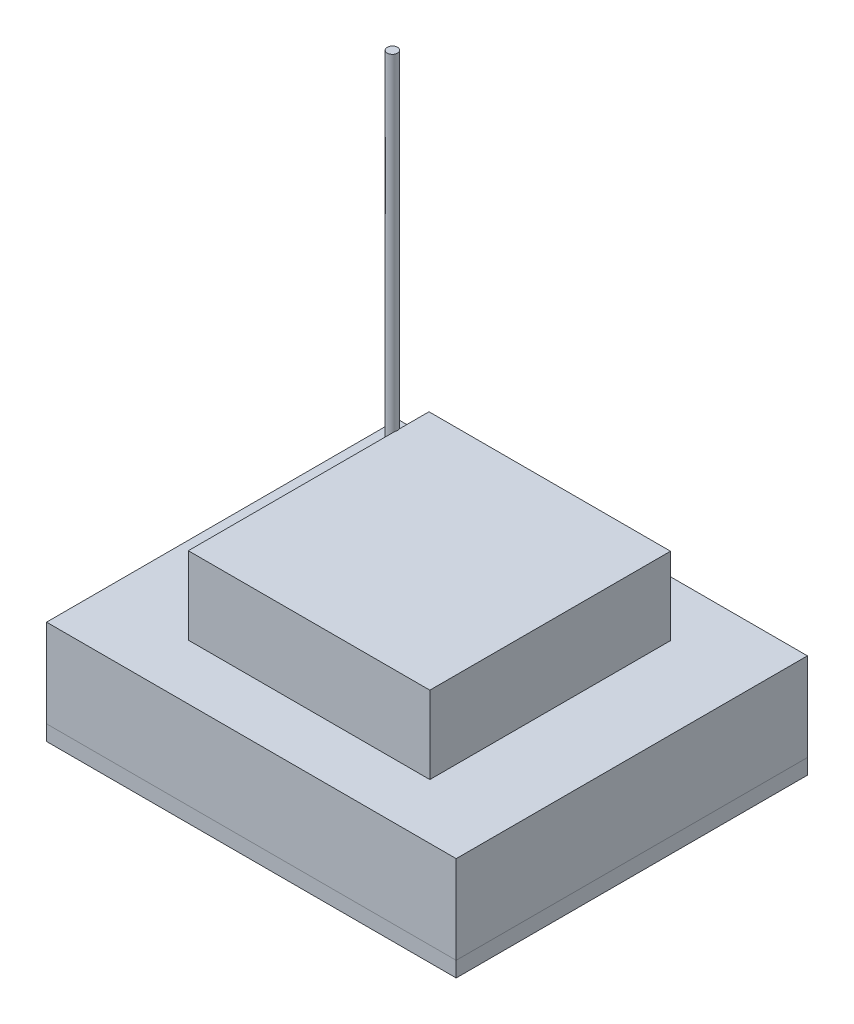
ISO-10303-21;
HEADER;
FILE_DESCRIPTION(('STEP AP214'),'2;1');
FILE_NAME('part.step','',(''),(''),'','','');
FILE_SCHEMA(('AUTOMOTIVE_DESIGN { 1 0 10303 214 1 1 1 1 }'));
ENDSEC;
DATA;
#1=APPLICATION_CONTEXT('core data for automotive mechanical design processes');
#2=APPLICATION_PROTOCOL_DEFINITION('international standard','automotive_design',2000,#1);
#3=PRODUCT_CONTEXT('',#1,'mechanical');
#4=PRODUCT('Part','Part','',(#3));
#5=PRODUCT_RELATED_PRODUCT_CATEGORY('part','',(#4));
#6=PRODUCT_DEFINITION_FORMATION('','',#4);
#7=PRODUCT_DEFINITION_CONTEXT('part definition',#1,'design');
#8=PRODUCT_DEFINITION('design','',#6,#7);
#9=PRODUCT_DEFINITION_SHAPE('','',#8);
#10=(LENGTH_UNIT() NAMED_UNIT(*) SI_UNIT(.MILLI.,.METRE.));
#11=(NAMED_UNIT(*) PLANE_ANGLE_UNIT() SI_UNIT($,.RADIAN.));
#12=(NAMED_UNIT(*) SI_UNIT($,.STERADIAN.) SOLID_ANGLE_UNIT());
#13=UNCERTAINTY_MEASURE_WITH_UNIT(LENGTH_MEASURE(1.E-05),#10,'distance_accuracy_value','');
#14=(GEOMETRIC_REPRESENTATION_CONTEXT(3) GLOBAL_UNCERTAINTY_ASSIGNED_CONTEXT((#13)) GLOBAL_UNIT_ASSIGNED_CONTEXT((#10,
#11,#12)) REPRESENTATION_CONTEXT('',''));
#15=CARTESIAN_POINT('',(0.,0.,0.));
#16=DIRECTION('',(0.,0.,1.));
#17=DIRECTION('',(1.,0.,0.));
#18=AXIS2_PLACEMENT_3D('',#15,#16,#17);
#19=CARTESIAN_POINT('',(-509.3,-147.5835,436.75));
#20=DIRECTION('',(1.,0.,0.));
#21=DIRECTION('',(0.,0.,-1.));
#22=AXIS2_PLACEMENT_3D('',#19,#20,#21);
#23=PLANE('',#22);
#24=DIRECTION('',(0.,0.,-1.));
#25=VECTOR('',#24,1.);
#26=CARTESIAN_POINT('',(-509.3,-109.4835,436.75));
#27=LINE('',#26,#25);
#28=CARTESIAN_POINT('',(-509.3,-109.4835,436.75));
#29=VERTEX_POINT('',#28);
#30=CARTESIAN_POINT('',(-509.3,-109.4835,-436.75));
#31=VERTEX_POINT('',#30);
#32=EDGE_CURVE('E116',#29,#31,#27,.T.);
#33=ORIENTED_EDGE('',*,*,#32,.T.);
#34=DIRECTION('',(0.,1.,0.));
#35=VECTOR('',#34,1.);
#36=CARTESIAN_POINT('',(-509.3,-147.5835,-436.75));
#37=LINE('',#36,#35);
#38=CARTESIAN_POINT('',(-509.3,-147.5835,-436.75));
#39=VERTEX_POINT('',#38);
#40=EDGE_CURVE('E12',#39,#31,#37,.T.);
#41=ORIENTED_EDGE('',*,*,#40,.F.);
#42=DIRECTION('',(0.,0.,-1.));
#43=VECTOR('',#42,1.);
#44=CARTESIAN_POINT('',(-509.3,-147.5835,436.75));
#45=LINE('',#44,#43);
#46=CARTESIAN_POINT('',(-509.3,-147.5835,436.75));
#47=VERTEX_POINT('',#46);
#48=EDGE_CURVE('E104',#47,#39,#45,.T.);
#49=ORIENTED_EDGE('',*,*,#48,.F.);
#50=DIRECTION('',(0.,1.,0.));
#51=VECTOR('',#50,1.);
#52=CARTESIAN_POINT('',(-509.3,-147.5835,436.75));
#53=LINE('',#52,#51);
#54=EDGE_CURVE('E112',#47,#29,#53,.T.);
#55=ORIENTED_EDGE('',*,*,#54,.T.);
#56=EDGE_LOOP('',(#33,#41,#49,#55));
#57=FACE_BOUND('',#56,.T.);
#58=ADVANCED_FACE('F53',(#57),#23,.F.);
#59=CARTESIAN_POINT('',(-509.3,-147.5835,-436.75));
#60=DIRECTION('',(0.,0.,1.));
#61=DIRECTION('',(1.,0.,0.));
#62=AXIS2_PLACEMENT_3D('',#59,#60,#61);
#63=PLANE('',#62);
#64=DIRECTION('',(1.,0.,0.));
#65=VECTOR('',#64,1.);
#66=CARTESIAN_POINT('',(-509.3,-109.4835,-436.75));
#67=LINE('',#66,#65);
#68=CARTESIAN_POINT('',(509.3,-109.4835,-436.75));
#69=VERTEX_POINT('',#68);
#70=EDGE_CURVE('E108',#31,#69,#67,.T.);
#71=ORIENTED_EDGE('',*,*,#70,.T.);
#72=DIRECTION('',(0.,1.,0.));
#73=VECTOR('',#72,1.);
#74=CARTESIAN_POINT('',(509.3,-147.5835,-436.75));
#75=LINE('',#74,#73);
#76=CARTESIAN_POINT('',(509.3,-147.5835,-436.75));
#77=VERTEX_POINT('',#76);
#78=EDGE_CURVE('E61',#77,#69,#75,.T.);
#79=ORIENTED_EDGE('',*,*,#78,.F.);
#80=DIRECTION('',(1.,0.,0.));
#81=VECTOR('',#80,1.);
#82=CARTESIAN_POINT('',(-509.3,-147.5835,-436.75));
#83=LINE('',#82,#81);
#84=EDGE_CURVE('E99',#39,#77,#83,.T.);
#85=ORIENTED_EDGE('',*,*,#84,.F.);
#86=ORIENTED_EDGE('',*,*,#40,.T.);
#87=EDGE_LOOP('',(#71,#79,#85,#86));
#88=FACE_BOUND('',#87,.T.);
#89=ADVANCED_FACE('F107',(#88),#63,.F.);
#90=CARTESIAN_POINT('',(509.3,-147.5835,-436.75));
#91=DIRECTION('',(-1.,0.,0.));
#92=DIRECTION('',(0.,0.,1.));
#93=AXIS2_PLACEMENT_3D('',#90,#91,#92);
#94=PLANE('',#93);
#95=DIRECTION('',(0.,0.,1.));
#96=VECTOR('',#95,1.);
#97=CARTESIAN_POINT('',(509.3,-109.4835,-436.75));
#98=LINE('',#97,#96);
#99=CARTESIAN_POINT('',(509.3,-109.4835,436.75));
#100=VERTEX_POINT('',#99);
#101=EDGE_CURVE('E86',#69,#100,#98,.T.);
#102=ORIENTED_EDGE('',*,*,#101,.T.);
#103=DIRECTION('',(0.,1.,0.));
#104=VECTOR('',#103,1.);
#105=CARTESIAN_POINT('',(509.3,-147.5835,436.75));
#106=LINE('',#105,#104);
#107=CARTESIAN_POINT('',(509.3,-147.5835,436.75));
#108=VERTEX_POINT('',#107);
#109=EDGE_CURVE('E109',#108,#100,#106,.T.);
#110=ORIENTED_EDGE('',*,*,#109,.F.);
#111=DIRECTION('',(0.,0.,1.));
#112=VECTOR('',#111,1.);
#113=CARTESIAN_POINT('',(509.3,-147.5835,-436.75));
#114=LINE('',#113,#112);
#115=EDGE_CURVE('E102',#77,#108,#114,.T.);
#116=ORIENTED_EDGE('',*,*,#115,.F.);
#117=ORIENTED_EDGE('',*,*,#78,.T.);
#118=EDGE_LOOP('',(#102,#110,#116,#117));
#119=FACE_BOUND('',#118,.T.);
#120=ADVANCED_FACE('F110',(#119),#94,.F.);
#121=CARTESIAN_POINT('',(509.3,-147.5835,436.75));
#122=DIRECTION('',(0.,0.,-1.));
#123=DIRECTION('',(-1.,0.,0.));
#124=AXIS2_PLACEMENT_3D('',#121,#122,#123);
#125=PLANE('',#124);
#126=DIRECTION('',(-1.,0.,0.));
#127=VECTOR('',#126,1.);
#128=CARTESIAN_POINT('',(509.3,-109.4835,436.75));
#129=LINE('',#128,#127);
#130=EDGE_CURVE('E92',#100,#29,#129,.T.);
#131=ORIENTED_EDGE('',*,*,#130,.T.);
#132=ORIENTED_EDGE('',*,*,#54,.F.);
#133=DIRECTION('',(-1.,0.,0.));
#134=VECTOR('',#133,1.);
#135=CARTESIAN_POINT('',(509.3,-147.5835,436.75));
#136=LINE('',#135,#134);
#137=EDGE_CURVE('E69',#108,#47,#136,.T.);
#138=ORIENTED_EDGE('',*,*,#137,.F.);
#139=ORIENTED_EDGE('',*,*,#109,.T.);
#140=EDGE_LOOP('',(#131,#132,#138,#139));
#141=FACE_BOUND('',#140,.T.);
#142=ADVANCED_FACE('F123',(#141),#125,.F.);
#143=CARTESIAN_POINT('',(0.,-147.5835,0.));
#144=DIRECTION('',(0.,-1.,0.));
#145=DIRECTION('',(0.,0.,-1.));
#146=AXIS2_PLACEMENT_3D('',#143,#144,#145);
#147=PLANE('',#146);
#148=ORIENTED_EDGE('',*,*,#48,.T.);
#149=ORIENTED_EDGE('',*,*,#84,.T.);
#150=ORIENTED_EDGE('',*,*,#115,.T.);
#151=ORIENTED_EDGE('',*,*,#137,.T.);
#152=EDGE_LOOP('',(#148,#149,#150,#151));
#153=FACE_BOUND('',#152,.T.);
#154=ADVANCED_FACE('F100',(#153),#147,.T.);
#155=CARTESIAN_POINT('',(0.,-109.4835,0.));
#156=DIRECTION('',(0.,-1.,0.));
#157=DIRECTION('',(0.,0.,-1.));
#158=AXIS2_PLACEMENT_3D('',#155,#156,#157);
#159=PLANE('',#158);
#160=ORIENTED_EDGE('',*,*,#32,.F.);
#161=ORIENTED_EDGE('',*,*,#130,.F.);
#162=ORIENTED_EDGE('',*,*,#101,.F.);
#163=ORIENTED_EDGE('',*,*,#70,.F.);
#164=EDGE_LOOP('',(#160,#161,#162,#163));
#165=FACE_BOUND('',#164,.T.);
#166=ADVANCED_FACE('F126',(#165),#159,.F.);
#167=CLOSED_SHELL('',(#58,#89,#120,#142,#154,#166));
#168=MANIFOLD_SOLID_BREP('B2',#167);
#169=CARTESIAN_POINT('',(-294.3,109.4835,299.25));
#170=DIRECTION('',(1.,0.,0.));
#171=DIRECTION('',(0.,0.,-1.));
#172=AXIS2_PLACEMENT_3D('',#169,#170,#171);
#173=PLANE('',#172);
#174=DIRECTION('',(0.,-1.,0.));
#175=VECTOR('',#174,1.);
#176=CARTESIAN_POINT('',(-294.3,1114.5435,-215.010364385909));
#177=LINE('',#176,#175);
#178=CARTESIAN_POINT('',(-294.3,109.4835,-215.010364385909));
#179=VERTEX_POINT('',#178);
#180=CARTESIAN_POINT('',(-294.3,302.0435,-215.010364385909));
#181=VERTEX_POINT('',#180);
#182=EDGE_CURVE('E224',#179,#181,#177,.F.);
#183=ORIENTED_EDGE('',*,*,#182,.F.);
#184=DIRECTION('',(0.,0.,-1.));
#185=VECTOR('',#184,1.);
#186=CARTESIAN_POINT('',(-294.3,109.4835,299.25));
#187=LINE('',#186,#185);
#188=CARTESIAN_POINT('',(-294.3,109.4835,299.25));
#189=VERTEX_POINT('',#188);
#190=EDGE_CURVE('E322',#189,#179,#187,.T.);
#191=ORIENTED_EDGE('',*,*,#190,.F.);
#192=DIRECTION('',(0.,-1.,0.));
#193=VECTOR('',#192,1.);
#194=CARTESIAN_POINT('',(-294.3,109.4835,299.25));
#195=LINE('',#194,#193);
#196=CARTESIAN_POINT('',(-294.3,302.0435,299.25));
#197=VERTEX_POINT('',#196);
#198=EDGE_CURVE('E306',#197,#189,#195,.T.);
#199=ORIENTED_EDGE('',*,*,#198,.F.);
#200=DIRECTION('',(0.,0.,-1.));
#201=VECTOR('',#200,1.);
#202=CARTESIAN_POINT('',(-294.3,302.0435,299.25));
#203=LINE('',#202,#201);
#204=EDGE_CURVE('E289',#197,#181,#203,.T.);
#205=ORIENTED_EDGE('',*,*,#204,.T.);
#206=EDGE_LOOP('',(#183,#191,#199,#205));
#207=FACE_BOUND('',#206,.T.);
#208=ADVANCED_FACE('F201',(#207),#173,.F.);
#209=DIRECTION('',(0.,-1.,0.));
#210=VECTOR('',#209,1.);
#211=CARTESIAN_POINT('',(-294.3,1114.5435,-224.889635614091));
#212=LINE('',#211,#210);
#213=CARTESIAN_POINT('',(-294.3,302.0435,-224.889635614091));
#214=VERTEX_POINT('',#213);
#215=CARTESIAN_POINT('',(-294.3,109.4835,-224.889635614091));
#216=VERTEX_POINT('',#215);
#217=EDGE_CURVE('E293',#214,#216,#212,.T.);
#218=ORIENTED_EDGE('',*,*,#217,.F.);
#219=CARTESIAN_POINT('',(-294.3,302.0435,-299.25));
#220=VERTEX_POINT('',#219);
#221=EDGE_CURVE('E279',#214,#220,#203,.T.);
#222=ORIENTED_EDGE('',*,*,#221,.T.);
#223=DIRECTION('',(0.,-1.,0.));
#224=VECTOR('',#223,1.);
#225=CARTESIAN_POINT('',(-294.3,109.4835,-299.25));
#226=LINE('',#225,#224);
#227=CARTESIAN_POINT('',(-294.3,109.4835,-299.25));
#228=VERTEX_POINT('',#227);
#229=EDGE_CURVE('E300',#220,#228,#226,.T.);
#230=ORIENTED_EDGE('',*,*,#229,.T.);
#231=EDGE_CURVE('E295',#216,#228,#187,.T.);
#232=ORIENTED_EDGE('',*,*,#231,.F.);
#233=EDGE_LOOP('',(#218,#222,#230,#232));
#234=FACE_BOUND('',#233,.T.);
#235=ADVANCED_FACE('F294',(#234),#173,.F.);
#236=CARTESIAN_POINT('',(509.3,-109.4835,436.75));
#237=DIRECTION('',(-1.,0.,0.));
#238=DIRECTION('',(0.,0.,1.));
#239=AXIS2_PLACEMENT_3D('',#236,#237,#238);
#240=PLANE('',#239);
#241=DIRECTION('',(0.,1.,0.));
#242=VECTOR('',#241,1.);
#243=CARTESIAN_POINT('',(509.3,-109.4835,-436.75));
#244=LINE('',#243,#242);
#245=CARTESIAN_POINT('',(509.3,-109.4835,-436.75));
#246=VERTEX_POINT('',#245);
#247=CARTESIAN_POINT('',(509.3,109.4835,-436.75));
#248=VERTEX_POINT('',#247);
#249=EDGE_CURVE('E324',#246,#248,#244,.T.);
#250=ORIENTED_EDGE('',*,*,#249,.T.);
#251=DIRECTION('',(0.,0.,-1.));
#252=VECTOR('',#251,1.);
#253=CARTESIAN_POINT('',(509.3,109.4835,436.75));
#254=LINE('',#253,#252);
#255=CARTESIAN_POINT('',(509.3,109.4835,436.75));
#256=VERTEX_POINT('',#255);
#257=EDGE_CURVE('E209',#256,#248,#254,.T.);
#258=ORIENTED_EDGE('',*,*,#257,.F.);
#259=DIRECTION('',(0.,1.,0.));
#260=VECTOR('',#259,1.);
#261=CARTESIAN_POINT('',(509.3,-109.4835,436.75));
#262=LINE('',#261,#260);
#263=CARTESIAN_POINT('',(509.3,-109.4835,436.75));
#264=VERTEX_POINT('',#263);
#265=EDGE_CURVE('E325',#264,#256,#262,.T.);
#266=ORIENTED_EDGE('',*,*,#265,.F.);
#267=DIRECTION('',(0.,0.,-1.));
#268=VECTOR('',#267,1.);
#269=CARTESIAN_POINT('',(509.3,-109.4835,436.75));
#270=LINE('',#269,#268);
#271=EDGE_CURVE('E335',#264,#246,#270,.T.);
#272=ORIENTED_EDGE('',*,*,#271,.T.);
#273=EDGE_LOOP('',(#250,#258,#266,#272));
#274=FACE_BOUND('',#273,.T.);
#275=ADVANCED_FACE('F203',(#274),#240,.F.);
#276=CARTESIAN_POINT('',(-509.3,109.4835,436.75));
#277=DIRECTION('',(0.,-1.,0.));
#278=DIRECTION('',(0.,0.,-1.));
#279=AXIS2_PLACEMENT_3D('',#276,#277,#278);
#280=PLANE('',#279);
#281=CARTESIAN_POINT('',(-306.,109.4835,-219.95));
#282=DIRECTION('',(0.,1.,0.));
#283=DIRECTION('',(0.,0.,1.));
#284=AXIS2_PLACEMENT_3D('',#281,#282,#283);
#285=CIRCLE('',#284,12.7);
#286=EDGE_CURVE('E216',#216,#179,#285,.T.);
#287=ORIENTED_EDGE('',*,*,#286,.F.);
#288=ORIENTED_EDGE('',*,*,#231,.T.);
#289=DIRECTION('',(1.,0.,0.));
#290=VECTOR('',#289,1.);
#291=CARTESIAN_POINT('',(-294.3,109.4835,-299.25));
#292=LINE('',#291,#290);
#293=CARTESIAN_POINT('',(306.3,109.4835,-299.25));
#294=VERTEX_POINT('',#293);
#295=EDGE_CURVE('E302',#228,#294,#292,.T.);
#296=ORIENTED_EDGE('',*,*,#295,.T.);
#297=DIRECTION('',(0.,0.,-1.));
#298=VECTOR('',#297,1.);
#299=CARTESIAN_POINT('',(306.3,109.4835,299.25));
#300=LINE('',#299,#298);
#301=CARTESIAN_POINT('',(306.3,109.4835,299.25));
#302=VERTEX_POINT('',#301);
#303=EDGE_CURVE('E320',#302,#294,#300,.T.);
#304=ORIENTED_EDGE('',*,*,#303,.F.);
#305=DIRECTION('',(1.,0.,0.));
#306=VECTOR('',#305,1.);
#307=CARTESIAN_POINT('',(-294.3,109.4835,299.25));
#308=LINE('',#307,#306);
#309=EDGE_CURVE('E308',#189,#302,#308,.T.);
#310=ORIENTED_EDGE('',*,*,#309,.F.);
#311=ORIENTED_EDGE('',*,*,#190,.T.);
#312=EDGE_LOOP('',(#287,#288,#296,#304,#310,#311));
#313=FACE_BOUND('',#312,.T.);
#314=DIRECTION('',(-1.,0.,0.));
#315=VECTOR('',#314,1.);
#316=CARTESIAN_POINT('',(-509.3,109.4835,-436.75));
#317=LINE('',#316,#315);
#318=CARTESIAN_POINT('',(-509.3,109.4835,-436.75));
#319=VERTEX_POINT('',#318);
#320=EDGE_CURVE('E338',#248,#319,#317,.T.);
#321=ORIENTED_EDGE('',*,*,#320,.T.);
#322=DIRECTION('',(0.,0.,-1.));
#323=VECTOR('',#322,1.);
#324=CARTESIAN_POINT('',(-509.3,109.4835,436.75));
#325=LINE('',#324,#323);
#326=CARTESIAN_POINT('',(-509.3,109.4835,436.75));
#327=VERTEX_POINT('',#326);
#328=EDGE_CURVE('E348',#327,#319,#325,.T.);
#329=ORIENTED_EDGE('',*,*,#328,.F.);
#330=DIRECTION('',(-1.,0.,0.));
#331=VECTOR('',#330,1.);
#332=CARTESIAN_POINT('',(-509.3,109.4835,436.75));
#333=LINE('',#332,#331);
#334=EDGE_CURVE('E328',#256,#327,#333,.T.);
#335=ORIENTED_EDGE('',*,*,#334,.F.);
#336=ORIENTED_EDGE('',*,*,#257,.T.);
#337=EDGE_LOOP('',(#321,#329,#335,#336));
#338=FACE_BOUND('',#337,.T.);
#339=ADVANCED_FACE('F353',(#313,#338),#280,.F.);
#340=CARTESIAN_POINT('',(-509.3,-109.4835,436.75));
#341=DIRECTION('',(1.,0.,0.));
#342=DIRECTION('',(0.,0.,-1.));
#343=AXIS2_PLACEMENT_3D('',#340,#341,#342);
#344=PLANE('',#343);
#345=DIRECTION('',(0.,-1.,0.));
#346=VECTOR('',#345,1.);
#347=CARTESIAN_POINT('',(-509.3,-109.4835,-436.75));
#348=LINE('',#347,#346);
#349=CARTESIAN_POINT('',(-509.3,-109.4835,-436.75));
#350=VERTEX_POINT('',#349);
#351=EDGE_CURVE('E340',#319,#350,#348,.T.);
#352=ORIENTED_EDGE('',*,*,#351,.T.);
#353=DIRECTION('',(0.,0.,-1.));
#354=VECTOR('',#353,1.);
#355=CARTESIAN_POINT('',(-509.3,-109.4835,436.75));
#356=LINE('',#355,#354);
#357=CARTESIAN_POINT('',(-509.3,-109.4835,436.75));
#358=VERTEX_POINT('',#357);
#359=EDGE_CURVE('E345',#358,#350,#356,.T.);
#360=ORIENTED_EDGE('',*,*,#359,.F.);
#361=DIRECTION('',(0.,-1.,0.));
#362=VECTOR('',#361,1.);
#363=CARTESIAN_POINT('',(-509.3,-109.4835,436.75));
#364=LINE('',#363,#362);
#365=EDGE_CURVE('E331',#327,#358,#364,.T.);
#366=ORIENTED_EDGE('',*,*,#365,.F.);
#367=ORIENTED_EDGE('',*,*,#328,.T.);
#368=EDGE_LOOP('',(#352,#360,#366,#367));
#369=FACE_BOUND('',#368,.T.);
#370=ADVANCED_FACE('F365',(#369),#344,.F.);
#371=CARTESIAN_POINT('',(-509.3,-109.4835,436.75));
#372=DIRECTION('',(0.,1.,0.));
#373=DIRECTION('',(0.,0.,1.));
#374=AXIS2_PLACEMENT_3D('',#371,#372,#373);
#375=PLANE('',#374);
#376=DIRECTION('',(1.,0.,0.));
#377=VECTOR('',#376,1.);
#378=CARTESIAN_POINT('',(-509.3,-109.4835,-436.75));
#379=LINE('',#378,#377);
#380=EDGE_CURVE('E329',#350,#246,#379,.T.);
#381=ORIENTED_EDGE('',*,*,#380,.T.);
#382=ORIENTED_EDGE('',*,*,#271,.F.);
#383=DIRECTION('',(1.,0.,0.));
#384=VECTOR('',#383,1.);
#385=CARTESIAN_POINT('',(-509.3,-109.4835,436.75));
#386=LINE('',#385,#384);
#387=EDGE_CURVE('E333',#358,#264,#386,.T.);
#388=ORIENTED_EDGE('',*,*,#387,.F.);
#389=ORIENTED_EDGE('',*,*,#359,.T.);
#390=EDGE_LOOP('',(#381,#382,#388,#389));
#391=FACE_BOUND('',#390,.T.);
#392=ADVANCED_FACE('F369',(#391),#375,.F.);
#393=CARTESIAN_POINT('',(0.,0.,436.75));
#394=DIRECTION('',(0.,0.,-1.));
#395=DIRECTION('',(-1.,0.,0.));
#396=AXIS2_PLACEMENT_3D('',#393,#394,#395);
#397=PLANE('',#396);
#398=ORIENTED_EDGE('',*,*,#265,.T.);
#399=ORIENTED_EDGE('',*,*,#334,.T.);
#400=ORIENTED_EDGE('',*,*,#365,.T.);
#401=ORIENTED_EDGE('',*,*,#387,.T.);
#402=EDGE_LOOP('',(#398,#399,#400,#401));
#403=FACE_BOUND('',#402,.T.);
#404=ADVANCED_FACE('F371',(#403),#397,.F.);
#405=CARTESIAN_POINT('',(0.,0.,-436.75));
#406=DIRECTION('',(0.,0.,-1.));
#407=DIRECTION('',(-1.,0.,0.));
#408=AXIS2_PLACEMENT_3D('',#405,#406,#407);
#409=PLANE('',#408);
#410=ORIENTED_EDGE('',*,*,#249,.F.);
#411=ORIENTED_EDGE('',*,*,#380,.F.);
#412=ORIENTED_EDGE('',*,*,#351,.F.);
#413=ORIENTED_EDGE('',*,*,#320,.F.);
#414=EDGE_LOOP('',(#410,#411,#412,#413));
#415=FACE_BOUND('',#414,.T.);
#416=ADVANCED_FACE('F361',(#415),#409,.T.);
#417=CARTESIAN_POINT('',(306.3,109.4835,299.25));
#418=DIRECTION('',(-1.,0.,0.));
#419=DIRECTION('',(0.,0.,1.));
#420=AXIS2_PLACEMENT_3D('',#417,#418,#419);
#421=PLANE('',#420);
#422=DIRECTION('',(0.,1.,0.));
#423=VECTOR('',#422,1.);
#424=CARTESIAN_POINT('',(306.3,109.4835,-299.25));
#425=LINE('',#424,#423);
#426=CARTESIAN_POINT('',(306.3,302.0435,-299.25));
#427=VERTEX_POINT('',#426);
#428=EDGE_CURVE('E315',#294,#427,#425,.T.);
#429=ORIENTED_EDGE('',*,*,#428,.T.);
#430=DIRECTION('',(0.,0.,-1.));
#431=VECTOR('',#430,1.);
#432=CARTESIAN_POINT('',(306.3,302.0435,299.25));
#433=LINE('',#432,#431);
#434=CARTESIAN_POINT('',(306.3,302.0435,299.25));
#435=VERTEX_POINT('',#434);
#436=EDGE_CURVE('E318',#435,#427,#433,.T.);
#437=ORIENTED_EDGE('',*,*,#436,.F.);
#438=DIRECTION('',(0.,1.,0.));
#439=VECTOR('',#438,1.);
#440=CARTESIAN_POINT('',(306.3,109.4835,299.25));
#441=LINE('',#440,#439);
#442=EDGE_CURVE('E310',#302,#435,#441,.T.);
#443=ORIENTED_EDGE('',*,*,#442,.F.);
#444=ORIENTED_EDGE('',*,*,#303,.T.);
#445=EDGE_LOOP('',(#429,#437,#443,#444));
#446=FACE_BOUND('',#445,.T.);
#447=ADVANCED_FACE('F378',(#446),#421,.F.);
#448=CARTESIAN_POINT('',(-294.3,302.0435,299.25));
#449=DIRECTION('',(0.,-1.,0.));
#450=DIRECTION('',(0.,0.,-1.));
#451=AXIS2_PLACEMENT_3D('',#448,#449,#450);
#452=PLANE('',#451);
#453=CARTESIAN_POINT('',(-306.,302.0435,-219.95));
#454=DIRECTION('',(0.,-1.,0.));
#455=DIRECTION('',(0.,0.,-1.));
#456=AXIS2_PLACEMENT_3D('',#453,#454,#455);
#457=CIRCLE('',#456,12.7);
#458=EDGE_CURVE('E51',#181,#214,#457,.F.);
#459=ORIENTED_EDGE('',*,*,#458,.F.);
#460=ORIENTED_EDGE('',*,*,#204,.F.);
#461=DIRECTION('',(-1.,0.,0.));
#462=VECTOR('',#461,1.);
#463=CARTESIAN_POINT('',(-294.3,302.0435,299.25));
#464=LINE('',#463,#462);
#465=EDGE_CURVE('E290',#435,#197,#464,.T.);
#466=ORIENTED_EDGE('',*,*,#465,.F.);
#467=ORIENTED_EDGE('',*,*,#436,.T.);
#468=DIRECTION('',(-1.,0.,0.));
#469=VECTOR('',#468,1.);
#470=CARTESIAN_POINT('',(-294.3,302.0435,-299.25));
#471=LINE('',#470,#469);
#472=EDGE_CURVE('E285',#427,#220,#471,.T.);
#473=ORIENTED_EDGE('',*,*,#472,.T.);
#474=ORIENTED_EDGE('',*,*,#221,.F.);
#475=EDGE_LOOP('',(#459,#460,#466,#467,#473,#474));
#476=FACE_BOUND('',#475,.T.);
#477=ADVANCED_FACE('F281',(#476),#452,.F.);
#478=CARTESIAN_POINT('',(0.,0.,299.25));
#479=DIRECTION('',(0.,0.,-1.));
#480=DIRECTION('',(-1.,0.,0.));
#481=AXIS2_PLACEMENT_3D('',#478,#479,#480);
#482=PLANE('',#481);
#483=ORIENTED_EDGE('',*,*,#198,.T.);
#484=ORIENTED_EDGE('',*,*,#309,.T.);
#485=ORIENTED_EDGE('',*,*,#442,.T.);
#486=ORIENTED_EDGE('',*,*,#465,.T.);
#487=EDGE_LOOP('',(#483,#484,#485,#486));
#488=FACE_BOUND('',#487,.T.);
#489=ADVANCED_FACE('F393',(#488),#482,.F.);
#490=CARTESIAN_POINT('',(0.,0.,-299.25));
#491=DIRECTION('',(0.,0.,-1.));
#492=DIRECTION('',(-1.,0.,0.));
#493=AXIS2_PLACEMENT_3D('',#490,#491,#492);
#494=PLANE('',#493);
#495=ORIENTED_EDGE('',*,*,#229,.F.);
#496=ORIENTED_EDGE('',*,*,#472,.F.);
#497=ORIENTED_EDGE('',*,*,#428,.F.);
#498=ORIENTED_EDGE('',*,*,#295,.F.);
#499=EDGE_LOOP('',(#495,#496,#497,#498));
#500=FACE_BOUND('',#499,.T.);
#501=ADVANCED_FACE('F394',(#500),#494,.T.);
#502=CARTESIAN_POINT('',(-306.,1114.5435,-219.95));
#503=DIRECTION('',(0.,-1.,0.));
#504=DIRECTION('',(0.,0.,-1.));
#505=AXIS2_PLACEMENT_3D('',#502,#503,#504);
#506=CYLINDRICAL_SURFACE('',#505,12.7);
#507=CARTESIAN_POINT('',(-306.,1114.5435,-219.95));
#508=DIRECTION('',(0.,1.,0.));
#509=DIRECTION('',(0.,0.,1.));
#510=AXIS2_PLACEMENT_3D('',#507,#508,#509);
#511=CIRCLE('',#510,12.7);
#512=CARTESIAN_POINT('',(-306.,1114.5435,-207.25));
#513=VERTEX_POINT('',#512);
#514=EDGE_CURVE('E297',#513,#513,#511,.T.);
#515=ORIENTED_EDGE('',*,*,#514,.F.);
#516=EDGE_LOOP('',(#515));
#517=FACE_BOUND('',#516,.T.);
#518=ORIENTED_EDGE('',*,*,#286,.T.);
#519=ORIENTED_EDGE('',*,*,#182,.T.);
#520=ORIENTED_EDGE('',*,*,#458,.T.);
#521=ORIENTED_EDGE('',*,*,#217,.T.);
#522=EDGE_LOOP('',(#518,#519,#520,#521));
#523=FACE_BOUND('',#522,.T.);
#524=ADVANCED_FACE('F299',(#517,#523),#506,.T.);
#525=CARTESIAN_POINT('',(-306.,1114.5435,-219.95));
#526=DIRECTION('',(0.,1.,0.));
#527=DIRECTION('',(0.,0.,1.));
#528=AXIS2_PLACEMENT_3D('',#525,#526,#527);
#529=PLANE('',#528);
#530=ORIENTED_EDGE('',*,*,#514,.T.);
#531=EDGE_LOOP('',(#530));
#532=FACE_BOUND('',#531,.T.);
#533=ADVANCED_FACE('F402',(#532),#529,.T.);
#534=CLOSED_SHELL('',(#208,#235,#275,#339,#370,#392,#404,#416,#447,#477,#489,#501,#524,#533));
#535=MANIFOLD_SOLID_BREP('B6',#534);
#536=ADVANCED_BREP_SHAPE_REPRESENTATION('',(#18,#168,#535),#14);
#537=SHAPE_DEFINITION_REPRESENTATION(#9,#536);
ENDSEC;
END-ISO-10303-21;
